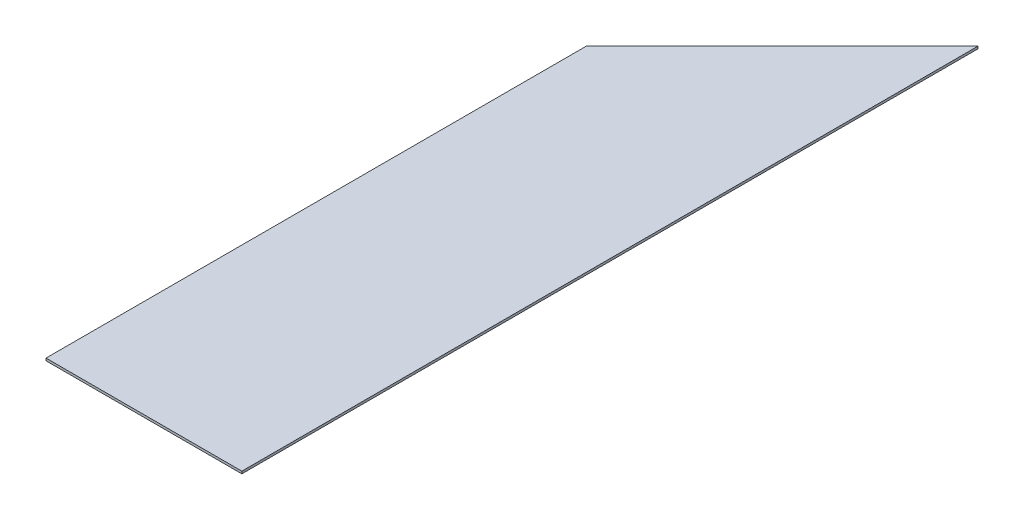
ISO-10303-21;
HEADER;
FILE_DESCRIPTION(('STEP AP214'),'2;1');
FILE_NAME('part.step','',(''),(''),'','','');
FILE_SCHEMA(('AUTOMOTIVE_DESIGN { 1 0 10303 214 1 1 1 1 }'));
ENDSEC;
DATA;
#1=APPLICATION_CONTEXT('core data for automotive mechanical design processes');
#2=APPLICATION_PROTOCOL_DEFINITION('international standard','automotive_design',2000,#1);
#3=PRODUCT_CONTEXT('',#1,'mechanical');
#4=PRODUCT('Part','Part','',(#3));
#5=PRODUCT_RELATED_PRODUCT_CATEGORY('part','',(#4));
#6=PRODUCT_DEFINITION_FORMATION('','',#4);
#7=PRODUCT_DEFINITION_CONTEXT('part definition',#1,'design');
#8=PRODUCT_DEFINITION('design','',#6,#7);
#9=PRODUCT_DEFINITION_SHAPE('','',#8);
#10=(LENGTH_UNIT() NAMED_UNIT(*) SI_UNIT(.MILLI.,.METRE.));
#11=(NAMED_UNIT(*) PLANE_ANGLE_UNIT() SI_UNIT($,.RADIAN.));
#12=(NAMED_UNIT(*) SI_UNIT($,.STERADIAN.) SOLID_ANGLE_UNIT());
#13=UNCERTAINTY_MEASURE_WITH_UNIT(LENGTH_MEASURE(1.E-05),#10,'distance_accuracy_value','');
#14=(GEOMETRIC_REPRESENTATION_CONTEXT(3) GLOBAL_UNCERTAINTY_ASSIGNED_CONTEXT((#13)) GLOBAL_UNIT_ASSIGNED_CONTEXT((#10,
#11,#12)) REPRESENTATION_CONTEXT('',''));
#15=CARTESIAN_POINT('',(0.,0.,0.));
#16=DIRECTION('',(0.,0.,1.));
#17=DIRECTION('',(1.,0.,0.));
#18=AXIS2_PLACEMENT_3D('',#15,#16,#17);
#19=CARTESIAN_POINT('',(49.2604076400862,28.,49.2604076400856));
#20=DIRECTION('',(-0.707106781186551,0.,-0.707106781186544));
#21=DIRECTION('',(-0.707106781186544,0.,0.707106781186551));
#22=AXIS2_PLACEMENT_3D('',#19,#20,#21);
#23=PLANE('',#22);
#24=DIRECTION('',(0.707106781186544,0.,-0.707106781186551));
#25=VECTOR('',#24,1.);
#26=CARTESIAN_POINT('',(49.2604076400862,27.,49.2604076400856));
#27=LINE('',#26,#25);
#28=CARTESIAN_POINT('',(8.50000000000004,27.,90.0208152801722));
#29=VERTEX_POINT('',#28);
#30=CARTESIAN_POINT('',(91.5,27.,7.02081528017151));
#31=VERTEX_POINT('',#30);
#32=EDGE_CURVE('E145',#29,#31,#27,.T.);
#33=ORIENTED_EDGE('',*,*,#32,.F.);
#34=DIRECTION('',(0.,-1.,0.));
#35=VECTOR('',#34,1.);
#36=CARTESIAN_POINT('',(8.50000000000004,28.,90.0208152801722));
#37=LINE('',#36,#35);
#38=CARTESIAN_POINT('',(8.50000000000004,28.,90.0208152801722));
#39=VERTEX_POINT('',#38);
#40=EDGE_CURVE('E12',#39,#29,#37,.T.);
#41=ORIENTED_EDGE('',*,*,#40,.F.);
#42=DIRECTION('',(0.707106781186544,0.,-0.707106781186551));
#43=VECTOR('',#42,1.);
#44=CARTESIAN_POINT('',(49.2604076400862,28.,49.2604076400856));
#45=LINE('',#44,#43);
#46=CARTESIAN_POINT('',(91.5,28.,7.02081528017151));
#47=VERTEX_POINT('',#46);
#48=EDGE_CURVE('E137',#39,#47,#45,.T.);
#49=ORIENTED_EDGE('',*,*,#48,.T.);
#50=DIRECTION('',(0.,-1.,0.));
#51=VECTOR('',#50,1.);
#52=CARTESIAN_POINT('',(91.5,28.,7.02081528017151));
#53=LINE('',#52,#51);
#54=EDGE_CURVE('E98',#47,#31,#53,.T.);
#55=ORIENTED_EDGE('',*,*,#54,.T.);
#56=EDGE_LOOP('',(#33,#41,#49,#55));
#57=FACE_BOUND('',#56,.T.);
#58=ADVANCED_FACE('F82',(#57),#23,.T.);
#59=CARTESIAN_POINT('',(8.5,28.,0.));
#60=DIRECTION('',(-1.,0.,0.));
#61=DIRECTION('',(0.,-1.,0.));
#62=AXIS2_PLACEMENT_3D('',#59,#60,#61);
#63=PLANE('',#62);
#64=DIRECTION('',(0.,0.,-1.));
#65=VECTOR('',#64,1.);
#66=CARTESIAN_POINT('',(8.5,27.,0.));
#67=LINE('',#66,#65);
#68=CARTESIAN_POINT('',(8.50000000000001,27.,319.));
#69=VERTEX_POINT('',#68);
#70=EDGE_CURVE('E128',#69,#29,#67,.T.);
#71=ORIENTED_EDGE('',*,*,#70,.F.);
#72=DIRECTION('',(0.,-1.,0.));
#73=VECTOR('',#72,1.);
#74=CARTESIAN_POINT('',(8.50000000000001,28.,319.));
#75=LINE('',#74,#73);
#76=CARTESIAN_POINT('',(8.50000000000001,28.,319.));
#77=VERTEX_POINT('',#76);
#78=EDGE_CURVE('E90',#77,#69,#75,.T.);
#79=ORIENTED_EDGE('',*,*,#78,.F.);
#80=DIRECTION('',(0.,0.,-1.));
#81=VECTOR('',#80,1.);
#82=CARTESIAN_POINT('',(8.5,28.,0.));
#83=LINE('',#82,#81);
#84=EDGE_CURVE('E126',#77,#39,#83,.T.);
#85=ORIENTED_EDGE('',*,*,#84,.T.);
#86=ORIENTED_EDGE('',*,*,#40,.T.);
#87=EDGE_LOOP('',(#71,#79,#85,#86));
#88=FACE_BOUND('',#87,.T.);
#89=ADVANCED_FACE('F125',(#88),#63,.T.);
#90=CARTESIAN_POINT('',(0.,28.,319.));
#91=DIRECTION('',(0.,0.,1.));
#92=DIRECTION('',(1.,0.,0.));
#93=AXIS2_PLACEMENT_3D('',#90,#91,#92);
#94=PLANE('',#93);
#95=DIRECTION('',(-1.,0.,0.));
#96=VECTOR('',#95,1.);
#97=CARTESIAN_POINT('',(0.,27.,319.));
#98=LINE('',#97,#96);
#99=CARTESIAN_POINT('',(91.5,27.,319.));
#100=VERTEX_POINT('',#99);
#101=EDGE_CURVE('E148',#100,#69,#98,.T.);
#102=ORIENTED_EDGE('',*,*,#101,.F.);
#103=DIRECTION('',(0.,-1.,0.));
#104=VECTOR('',#103,1.);
#105=CARTESIAN_POINT('',(91.5,28.,319.));
#106=LINE('',#105,#104);
#107=CARTESIAN_POINT('',(91.5,28.,319.));
#108=VERTEX_POINT('',#107);
#109=EDGE_CURVE('E111',#108,#100,#106,.T.);
#110=ORIENTED_EDGE('',*,*,#109,.F.);
#111=DIRECTION('',(-1.,0.,0.));
#112=VECTOR('',#111,1.);
#113=CARTESIAN_POINT('',(0.,28.,319.));
#114=LINE('',#113,#112);
#115=EDGE_CURVE('E136',#108,#77,#114,.T.);
#116=ORIENTED_EDGE('',*,*,#115,.T.);
#117=ORIENTED_EDGE('',*,*,#78,.T.);
#118=EDGE_LOOP('',(#102,#110,#116,#117));
#119=FACE_BOUND('',#118,.T.);
#120=ADVANCED_FACE('F139',(#119),#94,.T.);
#121=CARTESIAN_POINT('',(91.5,28.,0.));
#122=DIRECTION('',(1.,0.,0.));
#123=DIRECTION('',(0.,1.,0.));
#124=AXIS2_PLACEMENT_3D('',#121,#122,#123);
#125=PLANE('',#124);
#126=DIRECTION('',(0.,0.,1.));
#127=VECTOR('',#126,1.);
#128=CARTESIAN_POINT('',(91.5,27.,0.));
#129=LINE('',#128,#127);
#130=EDGE_CURVE('E150',#31,#100,#129,.T.);
#131=ORIENTED_EDGE('',*,*,#130,.F.);
#132=ORIENTED_EDGE('',*,*,#54,.F.);
#133=DIRECTION('',(0.,0.,1.));
#134=VECTOR('',#133,1.);
#135=CARTESIAN_POINT('',(91.5,28.,0.));
#136=LINE('',#135,#134);
#137=EDGE_CURVE('E140',#47,#108,#136,.T.);
#138=ORIENTED_EDGE('',*,*,#137,.T.);
#139=ORIENTED_EDGE('',*,*,#109,.T.);
#140=EDGE_LOOP('',(#131,#132,#138,#139));
#141=FACE_BOUND('',#140,.T.);
#142=ADVANCED_FACE('F155',(#141),#125,.T.);
#143=CARTESIAN_POINT('',(0.,28.,0.));
#144=DIRECTION('',(0.,1.,0.));
#145=DIRECTION('',(-1.,0.,0.));
#146=AXIS2_PLACEMENT_3D('',#143,#144,#145);
#147=PLANE('',#146);
#148=ORIENTED_EDGE('',*,*,#48,.F.);
#149=ORIENTED_EDGE('',*,*,#84,.F.);
#150=ORIENTED_EDGE('',*,*,#115,.F.);
#151=ORIENTED_EDGE('',*,*,#137,.F.);
#152=EDGE_LOOP('',(#148,#149,#150,#151));
#153=FACE_BOUND('',#152,.T.);
#154=ADVANCED_FACE('F134',(#153),#147,.T.);
#155=CARTESIAN_POINT('',(0.,27.,0.));
#156=DIRECTION('',(0.,1.,0.));
#157=DIRECTION('',(-1.,0.,0.));
#158=AXIS2_PLACEMENT_3D('',#155,#156,#157);
#159=PLANE('',#158);
#160=ORIENTED_EDGE('',*,*,#32,.T.);
#161=ORIENTED_EDGE('',*,*,#130,.T.);
#162=ORIENTED_EDGE('',*,*,#101,.T.);
#163=ORIENTED_EDGE('',*,*,#70,.T.);
#164=EDGE_LOOP('',(#160,#161,#162,#163));
#165=FACE_BOUND('',#164,.T.);
#166=ADVANCED_FACE('F162',(#165),#159,.F.);
#167=CLOSED_SHELL('',(#58,#89,#120,#142,#154,#166));
#168=MANIFOLD_SOLID_BREP('B2',#167);
#169=ADVANCED_BREP_SHAPE_REPRESENTATION('',(#18,#168),#14);
#170=SHAPE_DEFINITION_REPRESENTATION(#9,#169);
ENDSEC;
END-ISO-10303-21;
